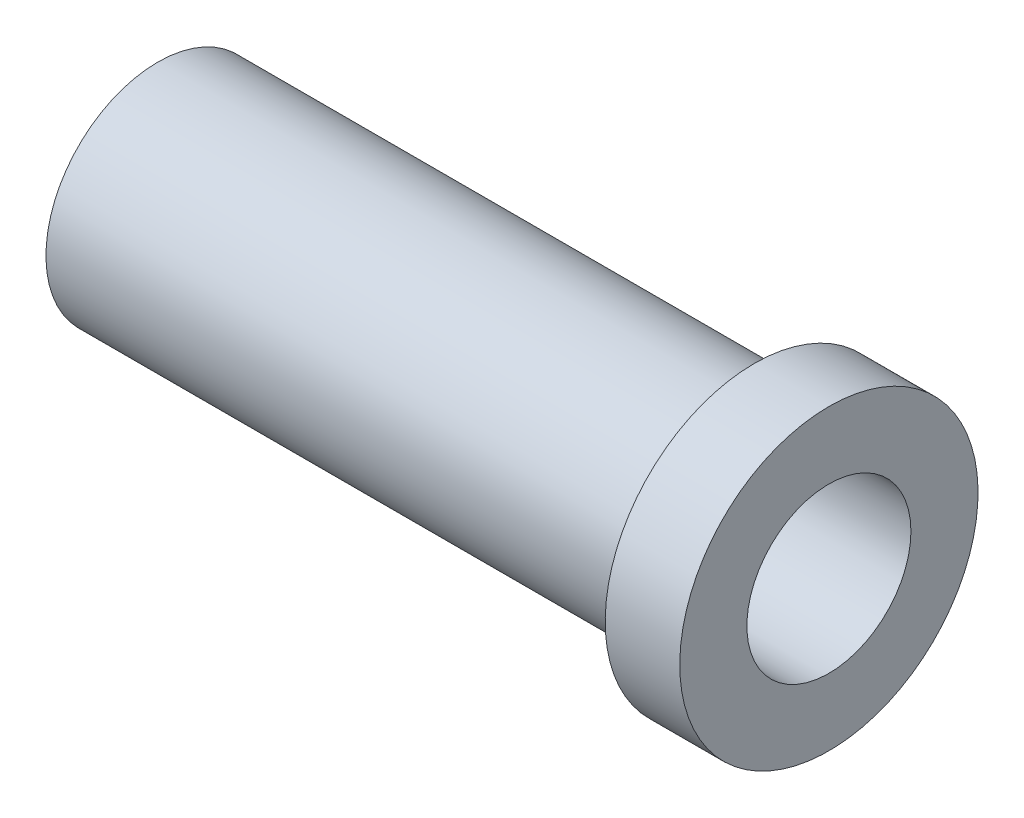
ISO-10303-21;
HEADER;
FILE_DESCRIPTION(('STEP AP214'),'2;1');
FILE_NAME('part.step','',(''),(''),'','','');
FILE_SCHEMA(('AUTOMOTIVE_DESIGN { 1 0 10303 214 1 1 1 1 }'));
ENDSEC;
DATA;
#1=APPLICATION_CONTEXT('core data for automotive mechanical design processes');
#2=APPLICATION_PROTOCOL_DEFINITION('international standard','automotive_design',2000,#1);
#3=PRODUCT_CONTEXT('',#1,'mechanical');
#4=PRODUCT('Part','Part','',(#3));
#5=PRODUCT_RELATED_PRODUCT_CATEGORY('part','',(#4));
#6=PRODUCT_DEFINITION_FORMATION('','',#4);
#7=PRODUCT_DEFINITION_CONTEXT('part definition',#1,'design');
#8=PRODUCT_DEFINITION('design','',#6,#7);
#9=PRODUCT_DEFINITION_SHAPE('','',#8);
#10=(LENGTH_UNIT() NAMED_UNIT(*) SI_UNIT(.MILLI.,.METRE.));
#11=(NAMED_UNIT(*) PLANE_ANGLE_UNIT() SI_UNIT($,.RADIAN.));
#12=(NAMED_UNIT(*) SI_UNIT($,.STERADIAN.) SOLID_ANGLE_UNIT());
#13=UNCERTAINTY_MEASURE_WITH_UNIT(LENGTH_MEASURE(1.E-05),#10,'distance_accuracy_value','');
#14=(GEOMETRIC_REPRESENTATION_CONTEXT(3) GLOBAL_UNCERTAINTY_ASSIGNED_CONTEXT((#13)) GLOBAL_UNIT_ASSIGNED_CONTEXT((#10,
#11,#12)) REPRESENTATION_CONTEXT('',''));
#15=CARTESIAN_POINT('',(0.,0.,0.));
#16=DIRECTION('',(0.,0.,1.));
#17=DIRECTION('',(1.,0.,0.));
#18=AXIS2_PLACEMENT_3D('',#15,#16,#17);
#19=CARTESIAN_POINT('',(0.,0.,0.));
#20=DIRECTION('',(-1.,0.,0.));
#21=DIRECTION('',(0.,-1.,0.));
#22=AXIS2_PLACEMENT_3D('',#19,#20,#21);
#23=PLANE('',#22);
#24=CARTESIAN_POINT('',(0.,0.,0.));
#25=DIRECTION('',(1.,0.,0.));
#26=DIRECTION('',(0.,0.,-1.));
#27=AXIS2_PLACEMENT_3D('',#24,#25,#26);
#28=CIRCLE('',#27,5.49999999999999);
#29=CARTESIAN_POINT('',(0.,0.,-5.49999999999999));
#30=VERTEX_POINT('',#29);
#31=EDGE_CURVE('E54',#30,#30,#28,.T.);
#32=ORIENTED_EDGE('',*,*,#31,.T.);
#33=EDGE_LOOP('',(#32));
#34=FACE_BOUND('',#33,.T.);
#35=CARTESIAN_POINT('',(0.,0.,0.));
#36=DIRECTION('',(1.,0.,0.));
#37=DIRECTION('',(0.,1.,0.));
#38=AXIS2_PLACEMENT_3D('',#35,#36,#37);
#39=CIRCLE('',#38,7.5);
#40=CARTESIAN_POINT('',(0.,7.5,0.));
#41=VERTEX_POINT('',#40);
#42=EDGE_CURVE('E10',#41,#41,#39,.T.);
#43=ORIENTED_EDGE('',*,*,#42,.F.);
#44=EDGE_LOOP('',(#43));
#45=FACE_BOUND('',#44,.T.);
#46=ADVANCED_FACE('F35',(#34,#45),#23,.T.);
#47=CARTESIAN_POINT('',(45.,0.,0.));
#48=DIRECTION('',(1.,0.,0.));
#49=DIRECTION('',(0.,1.,0.));
#50=AXIS2_PLACEMENT_3D('',#47,#48,#49);
#51=CYLINDRICAL_SURFACE('',#50,7.5);
#52=ORIENTED_EDGE('',*,*,#42,.T.);
#53=EDGE_LOOP('',(#52));
#54=FACE_BOUND('',#53,.T.);
#55=CARTESIAN_POINT('',(40.,0.,0.));
#56=DIRECTION('',(1.,0.,0.));
#57=DIRECTION('',(0.,1.,0.));
#58=AXIS2_PLACEMENT_3D('',#55,#56,#57);
#59=CIRCLE('',#58,7.5);
#60=CARTESIAN_POINT('',(40.,7.5,0.));
#61=VERTEX_POINT('',#60);
#62=EDGE_CURVE('E41',#61,#61,#59,.T.);
#63=ORIENTED_EDGE('',*,*,#62,.F.);
#64=EDGE_LOOP('',(#63));
#65=FACE_BOUND('',#64,.T.);
#66=ADVANCED_FACE('F77',(#54,#65),#51,.T.);
#67=CARTESIAN_POINT('',(40.,7.5,0.));
#68=DIRECTION('',(-1.,0.,0.));
#69=DIRECTION('',(0.,-1.,0.));
#70=AXIS2_PLACEMENT_3D('',#67,#68,#69);
#71=PLANE('',#70);
#72=ORIENTED_EDGE('',*,*,#62,.T.);
#73=EDGE_LOOP('',(#72));
#74=FACE_BOUND('',#73,.T.);
#75=CARTESIAN_POINT('',(40.,0.,0.));
#76=DIRECTION('',(1.,0.,0.));
#77=DIRECTION('',(0.,1.,0.));
#78=AXIS2_PLACEMENT_3D('',#75,#76,#77);
#79=CIRCLE('',#78,10.);
#80=CARTESIAN_POINT('',(40.,10.,0.));
#81=VERTEX_POINT('',#80);
#82=EDGE_CURVE('E45',#81,#81,#79,.T.);
#83=ORIENTED_EDGE('',*,*,#82,.F.);
#84=EDGE_LOOP('',(#83));
#85=FACE_BOUND('',#84,.T.);
#86=ADVANCED_FACE('F71',(#74,#85),#71,.T.);
#87=CARTESIAN_POINT('',(45.,0.,0.));
#88=DIRECTION('',(1.,0.,0.));
#89=DIRECTION('',(0.,1.,0.));
#90=AXIS2_PLACEMENT_3D('',#87,#88,#89);
#91=CYLINDRICAL_SURFACE('',#90,10.);
#92=ORIENTED_EDGE('',*,*,#82,.T.);
#93=EDGE_LOOP('',(#92));
#94=FACE_BOUND('',#93,.T.);
#95=CARTESIAN_POINT('',(45.,0.,0.));
#96=DIRECTION('',(1.,0.,0.));
#97=DIRECTION('',(0.,1.,0.));
#98=AXIS2_PLACEMENT_3D('',#95,#96,#97);
#99=CIRCLE('',#98,10.);
#100=CARTESIAN_POINT('',(45.,10.,0.));
#101=VERTEX_POINT('',#100);
#102=EDGE_CURVE('E49',#101,#101,#99,.T.);
#103=ORIENTED_EDGE('',*,*,#102,.F.);
#104=EDGE_LOOP('',(#103));
#105=FACE_BOUND('',#104,.T.);
#106=ADVANCED_FACE('F66',(#94,#105),#91,.T.);
#107=CARTESIAN_POINT('',(45.,10.,0.));
#108=DIRECTION('',(1.,0.,0.));
#109=DIRECTION('',(0.,1.,0.));
#110=AXIS2_PLACEMENT_3D('',#107,#108,#109);
#111=PLANE('',#110);
#112=CARTESIAN_POINT('',(45.,0.,0.));
#113=DIRECTION('',(1.,0.,0.));
#114=DIRECTION('',(0.,0.,-1.));
#115=AXIS2_PLACEMENT_3D('',#112,#113,#114);
#116=CIRCLE('',#115,5.49999999999999);
#117=CARTESIAN_POINT('',(45.,0.,-5.49999999999999));
#118=VERTEX_POINT('',#117);
#119=EDGE_CURVE('E57',#118,#118,#116,.T.);
#120=ORIENTED_EDGE('',*,*,#119,.F.);
#121=EDGE_LOOP('',(#120));
#122=FACE_BOUND('',#121,.T.);
#123=ORIENTED_EDGE('',*,*,#102,.T.);
#124=EDGE_LOOP('',(#123));
#125=FACE_BOUND('',#124,.T.);
#126=ADVANCED_FACE('F63',(#122,#125),#111,.T.);
#127=CARTESIAN_POINT('',(45.,0.,0.));
#128=DIRECTION('',(1.,0.,0.));
#129=DIRECTION('',(0.,0.,-1.));
#130=AXIS2_PLACEMENT_3D('',#127,#128,#129);
#131=CYLINDRICAL_SURFACE('',#130,5.49999999999999);
#132=ORIENTED_EDGE('',*,*,#31,.F.);
#133=EDGE_LOOP('',(#132));
#134=FACE_BOUND('',#133,.T.);
#135=ORIENTED_EDGE('',*,*,#119,.T.);
#136=EDGE_LOOP('',(#135));
#137=FACE_BOUND('',#136,.T.);
#138=ADVANCED_FACE('F61',(#134,#137),#131,.F.);
#139=CLOSED_SHELL('',(#46,#66,#86,#106,#126,#138));
#140=MANIFOLD_SOLID_BREP('B2',#139);
#141=ADVANCED_BREP_SHAPE_REPRESENTATION('',(#18,#140),#14);
#142=SHAPE_DEFINITION_REPRESENTATION(#9,#141);
ENDSEC;
END-ISO-10303-21;
